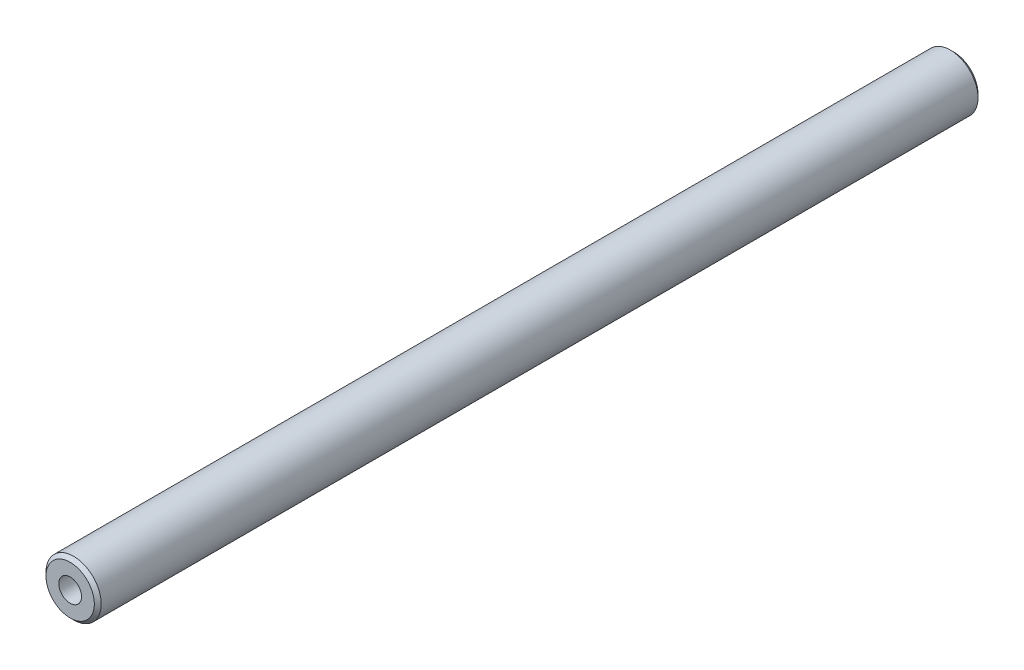
ISO-10303-21;
HEADER;
FILE_DESCRIPTION(('STEP AP214'),'2;1');
FILE_NAME('part.step','',(''),(''),'','','');
FILE_SCHEMA(('AUTOMOTIVE_DESIGN { 1 0 10303 214 1 1 1 1 }'));
ENDSEC;
DATA;
#1=APPLICATION_CONTEXT('core data for automotive mechanical design processes');
#2=APPLICATION_PROTOCOL_DEFINITION('international standard','automotive_design',2000,#1);
#3=PRODUCT_CONTEXT('',#1,'mechanical');
#4=PRODUCT('Part','Part','',(#3));
#5=PRODUCT_RELATED_PRODUCT_CATEGORY('part','',(#4));
#6=PRODUCT_DEFINITION_FORMATION('','',#4);
#7=PRODUCT_DEFINITION_CONTEXT('part definition',#1,'design');
#8=PRODUCT_DEFINITION('design','',#6,#7);
#9=PRODUCT_DEFINITION_SHAPE('','',#8);
#10=(LENGTH_UNIT() NAMED_UNIT(*) SI_UNIT(.MILLI.,.METRE.));
#11=(NAMED_UNIT(*) PLANE_ANGLE_UNIT() SI_UNIT($,.RADIAN.));
#12=(NAMED_UNIT(*) SI_UNIT($,.STERADIAN.) SOLID_ANGLE_UNIT());
#13=UNCERTAINTY_MEASURE_WITH_UNIT(LENGTH_MEASURE(1.E-05),#10,'distance_accuracy_value','');
#14=(GEOMETRIC_REPRESENTATION_CONTEXT(3) GLOBAL_UNCERTAINTY_ASSIGNED_CONTEXT((#13)) GLOBAL_UNIT_ASSIGNED_CONTEXT((#10,
#11,#12)) REPRESENTATION_CONTEXT('',''));
#15=CARTESIAN_POINT('',(0.,0.,0.));
#16=DIRECTION('',(0.,0.,1.));
#17=DIRECTION('',(1.,0.,0.));
#18=AXIS2_PLACEMENT_3D('',#15,#16,#17);
#19=CARTESIAN_POINT('',(0.,0.,116.499999999917));
#20=DIRECTION('',(0.,0.,1.));
#21=DIRECTION('',(0.,-1.,0.));
#22=AXIS2_PLACEMENT_3D('',#19,#20,#21);
#23=CONICAL_SURFACE('',#22,1.64999999992688,1.02974425861523);
#24=CARTESIAN_POINT('',(-5.6843418860808E-11,0.,115.508579978524));
#25=VERTEX_POINT('',#24);
#26=VERTEX_LOOP('',#25);
#27=FACE_BOUND('',#26,.T.);
#28=CARTESIAN_POINT('',(0.,0.,116.5));
#29=DIRECTION('',(0.,0.,1.));
#30=DIRECTION('',(1.,0.,0.));
#31=AXIS2_PLACEMENT_3D('',#28,#29,#30);
#32=CIRCLE('',#31,1.64999999999999);
#33=CARTESIAN_POINT('',(1.64999999999999,0.,116.5));
#34=VERTEX_POINT('',#33);
#35=EDGE_CURVE('E37',#34,#34,#32,.T.);
#36=ORIENTED_EDGE('',*,*,#35,.T.);
#37=EDGE_LOOP('',(#36));
#38=FACE_BOUND('',#37,.T.);
#39=ADVANCED_FACE('F17',(#27,#38),#23,.F.);
#40=CARTESIAN_POINT('',(0.,0.,11.5000000000123));
#41=DIRECTION('',(0.,0.,-1.));
#42=DIRECTION('',(-1.,0.,0.));
#43=AXIS2_PLACEMENT_3D('',#40,#41,#42);
#44=CONICAL_SURFACE('',#43,1.65000000004056,1.02974425860513);
#45=CARTESIAN_POINT('',(0.,-5.68426539819307E-11,12.4914200214619));
#46=VERTEX_POINT('',#45);
#47=VERTEX_LOOP('',#46);
#48=FACE_BOUND('',#47,.T.);
#49=CARTESIAN_POINT('',(0.,0.,11.5));
#50=DIRECTION('',(0.,0.,-1.));
#51=DIRECTION('',(0.,1.,0.));
#52=AXIS2_PLACEMENT_3D('',#49,#50,#51);
#53=CIRCLE('',#52,1.64999999999999);
#54=CARTESIAN_POINT('',(0.,1.64999999999999,11.5));
#55=VERTEX_POINT('',#54);
#56=EDGE_CURVE('E39',#55,#55,#53,.T.);
#57=ORIENTED_EDGE('',*,*,#56,.T.);
#58=EDGE_LOOP('',(#57));
#59=FACE_BOUND('',#58,.T.);
#60=ADVANCED_FACE('F34',(#48,#59),#44,.F.);
#61=CARTESIAN_POINT('',(0.,0.,128.));
#62=DIRECTION('',(0.,0.,1.));
#63=DIRECTION('',(1.,0.,0.));
#64=AXIS2_PLACEMENT_3D('',#61,#62,#63);
#65=CYLINDRICAL_SURFACE('',#64,1.64999999999999);
#66=CARTESIAN_POINT('',(0.,0.,128.));
#67=DIRECTION('',(0.,0.,1.));
#68=DIRECTION('',(1.,0.,0.));
#69=AXIS2_PLACEMENT_3D('',#66,#67,#68);
#70=CIRCLE('',#69,1.64999999999999);
#71=CARTESIAN_POINT('',(1.64999999999999,0.,128.));
#72=VERTEX_POINT('',#71);
#73=EDGE_CURVE('E20',#72,#72,#70,.F.);
#74=ORIENTED_EDGE('',*,*,#73,.F.);
#75=EDGE_LOOP('',(#74));
#76=FACE_BOUND('',#75,.T.);
#77=ORIENTED_EDGE('',*,*,#35,.F.);
#78=EDGE_LOOP('',(#77));
#79=FACE_BOUND('',#78,.T.);
#80=ADVANCED_FACE('F59',(#76,#79),#65,.F.);
#81=CARTESIAN_POINT('',(0.,0.,0.));
#82=DIRECTION('',(0.,0.,-1.));
#83=DIRECTION('',(0.,1.,0.));
#84=AXIS2_PLACEMENT_3D('',#81,#82,#83);
#85=CYLINDRICAL_SURFACE('',#84,1.64999999999999);
#86=ORIENTED_EDGE('',*,*,#56,.F.);
#87=EDGE_LOOP('',(#86));
#88=FACE_BOUND('',#87,.T.);
#89=CARTESIAN_POINT('',(0.,0.,0.));
#90=DIRECTION('',(0.,0.,-1.));
#91=DIRECTION('',(0.,1.,0.));
#92=AXIS2_PLACEMENT_3D('',#89,#90,#91);
#93=CIRCLE('',#92,1.64999999999999);
#94=CARTESIAN_POINT('',(0.,1.64999999999999,0.));
#95=VERTEX_POINT('',#94);
#96=EDGE_CURVE('E50',#95,#95,#93,.T.);
#97=ORIENTED_EDGE('',*,*,#96,.T.);
#98=EDGE_LOOP('',(#97));
#99=FACE_BOUND('',#98,.T.);
#100=ADVANCED_FACE('F61',(#88,#99),#85,.F.);
#101=CARTESIAN_POINT('',(0.,0.,128.));
#102=DIRECTION('',(0.,0.,1.));
#103=DIRECTION('',(1.,0.,0.));
#104=AXIS2_PLACEMENT_3D('',#101,#102,#103);
#105=PLANE('',#104);
#106=CARTESIAN_POINT('',(0.,0.,127.999999999929));
#107=DIRECTION('',(0.,0.,-1.));
#108=DIRECTION('',(-1.,0.,0.));
#109=AXIS2_PLACEMENT_3D('',#106,#107,#108);
#110=CIRCLE('',#109,3.50000000008777);
#111=CARTESIAN_POINT('',(-3.50000000008777,0.,127.999999999929));
#112=VERTEX_POINT('',#111);
#113=EDGE_CURVE('E48',#112,#112,#110,.T.);
#114=ORIENTED_EDGE('',*,*,#113,.F.);
#115=EDGE_LOOP('',(#114));
#116=FACE_BOUND('',#115,.T.);
#117=ORIENTED_EDGE('',*,*,#73,.T.);
#118=EDGE_LOOP('',(#117));
#119=FACE_BOUND('',#118,.T.);
#120=ADVANCED_FACE('F57',(#116,#119),#105,.T.);
#121=CARTESIAN_POINT('',(0.,0.,0.));
#122=DIRECTION('',(0.,0.,1.));
#123=DIRECTION('',(1.,0.,0.));
#124=AXIS2_PLACEMENT_3D('',#121,#122,#123);
#125=PLANE('',#124);
#126=CARTESIAN_POINT('',(0.,0.,-5.6843418860808E-11));
#127=DIRECTION('',(0.,0.,1.));
#128=DIRECTION('',(1.,0.,0.));
#129=AXIS2_PLACEMENT_3D('',#126,#127,#128);
#130=CIRCLE('',#129,3.49999999997408);
#131=CARTESIAN_POINT('',(3.49999999997408,0.,-5.6843418860808E-11));
#132=VERTEX_POINT('',#131);
#133=EDGE_CURVE('E45',#132,#132,#130,.T.);
#134=ORIENTED_EDGE('',*,*,#133,.F.);
#135=EDGE_LOOP('',(#134));
#136=FACE_BOUND('',#135,.T.);
#137=ORIENTED_EDGE('',*,*,#96,.F.);
#138=EDGE_LOOP('',(#137));
#139=FACE_BOUND('',#138,.T.);
#140=ADVANCED_FACE('F85',(#136,#139),#125,.F.);
#141=CARTESIAN_POINT('',(0.,0.,127.500000000111));
#142=DIRECTION('',(0.,0.,-1.));
#143=DIRECTION('',(-1.,0.,0.));
#144=AXIS2_PLACEMENT_3D('',#141,#142,#143);
#145=CONICAL_SURFACE('',#144,3.99999999984857,0.785398163340605);
#146=CARTESIAN_POINT('',(0.,0.,127.5));
#147=DIRECTION('',(0.,0.,-1.));
#148=DIRECTION('',(-1.,0.,0.));
#149=AXIS2_PLACEMENT_3D('',#146,#147,#148);
#150=CIRCLE('',#149,4.);
#151=CARTESIAN_POINT('',(-4.,0.,127.5));
#152=VERTEX_POINT('',#151);
#153=EDGE_CURVE('E26',#152,#152,#150,.T.);
#154=ORIENTED_EDGE('',*,*,#153,.F.);
#155=EDGE_LOOP('',(#154));
#156=FACE_BOUND('',#155,.T.);
#157=ORIENTED_EDGE('',*,*,#113,.T.);
#158=EDGE_LOOP('',(#157));
#159=FACE_BOUND('',#158,.T.);
#160=ADVANCED_FACE('F78',(#156,#159),#145,.T.);
#161=CARTESIAN_POINT('',(0.,0.,0.49999999987449));
#162=DIRECTION('',(0.,0.,1.));
#163=DIRECTION('',(1.,0.,0.));
#164=AXIS2_PLACEMENT_3D('',#161,#162,#163);
#165=CONICAL_SURFACE('',#164,3.99999999990541,0.785398163397448);
#166=CARTESIAN_POINT('',(0.,0.,0.499999999999973));
#167=DIRECTION('',(0.,0.,-1.));
#168=DIRECTION('',(-1.,0.,0.));
#169=AXIS2_PLACEMENT_3D('',#166,#167,#168);
#170=CIRCLE('',#169,4.);
#171=CARTESIAN_POINT('',(-4.,0.,0.499999999999973));
#172=VERTEX_POINT('',#171);
#173=EDGE_CURVE('E10',#172,#172,#170,.F.);
#174=ORIENTED_EDGE('',*,*,#173,.F.);
#175=EDGE_LOOP('',(#174));
#176=FACE_BOUND('',#175,.T.);
#177=ORIENTED_EDGE('',*,*,#133,.T.);
#178=EDGE_LOOP('',(#177));
#179=FACE_BOUND('',#178,.T.);
#180=ADVANCED_FACE('F72',(#176,#179),#165,.T.);
#181=CARTESIAN_POINT('',(0.,0.,128.));
#182=DIRECTION('',(0.,0.,-1.));
#183=DIRECTION('',(-1.,0.,0.));
#184=AXIS2_PLACEMENT_3D('',#181,#182,#183);
#185=CYLINDRICAL_SURFACE('',#184,4.);
#186=ORIENTED_EDGE('',*,*,#173,.T.);
#187=EDGE_LOOP('',(#186));
#188=FACE_BOUND('',#187,.T.);
#189=ORIENTED_EDGE('',*,*,#153,.T.);
#190=EDGE_LOOP('',(#189));
#191=FACE_BOUND('',#190,.T.);
#192=ADVANCED_FACE('F70',(#188,#191),#185,.T.);
#193=CLOSED_SHELL('',(#39,#60,#80,#100,#120,#140,#160,#180,#192));
#194=MANIFOLD_SOLID_BREP('B1',#193);
#195=ADVANCED_BREP_SHAPE_REPRESENTATION('',(#18,#194),#14);
#196=SHAPE_DEFINITION_REPRESENTATION(#9,#195);
ENDSEC;
END-ISO-10303-21;
